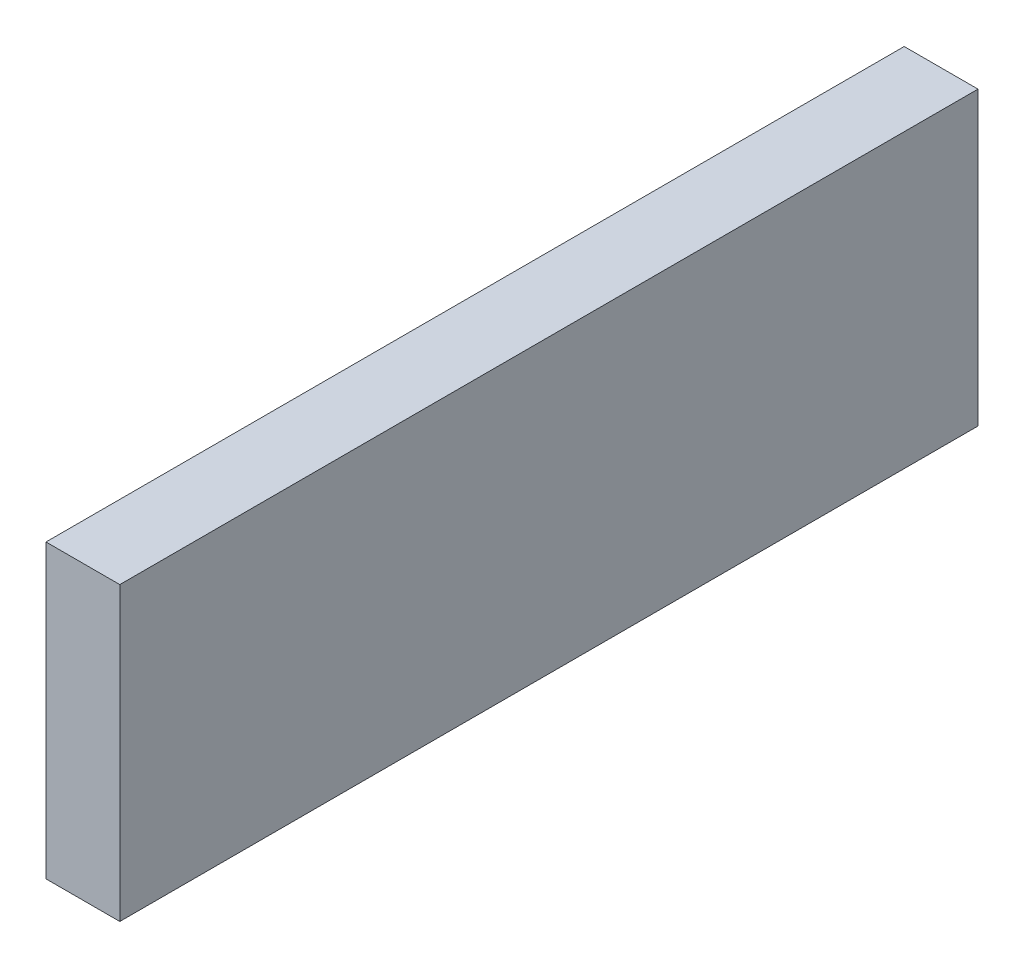
ISO-10303-21;
HEADER;
FILE_DESCRIPTION(('STEP AP214'),'2;1');
FILE_NAME('part.step','',(''),(''),'','','');
FILE_SCHEMA(('AUTOMOTIVE_DESIGN { 1 0 10303 214 1 1 1 1 }'));
ENDSEC;
DATA;
#1=APPLICATION_CONTEXT('core data for automotive mechanical design processes');
#2=APPLICATION_PROTOCOL_DEFINITION('international standard','automotive_design',2000,#1);
#3=PRODUCT_CONTEXT('',#1,'mechanical');
#4=PRODUCT('Part','Part','',(#3));
#5=PRODUCT_RELATED_PRODUCT_CATEGORY('part','',(#4));
#6=PRODUCT_DEFINITION_FORMATION('','',#4);
#7=PRODUCT_DEFINITION_CONTEXT('part definition',#1,'design');
#8=PRODUCT_DEFINITION('design','',#6,#7);
#9=PRODUCT_DEFINITION_SHAPE('','',#8);
#10=(LENGTH_UNIT() NAMED_UNIT(*) SI_UNIT(.MILLI.,.METRE.));
#11=(NAMED_UNIT(*) PLANE_ANGLE_UNIT() SI_UNIT($,.RADIAN.));
#12=(NAMED_UNIT(*) SI_UNIT($,.STERADIAN.) SOLID_ANGLE_UNIT());
#13=UNCERTAINTY_MEASURE_WITH_UNIT(LENGTH_MEASURE(1.E-05),#10,'distance_accuracy_value','');
#14=(GEOMETRIC_REPRESENTATION_CONTEXT(3) GLOBAL_UNCERTAINTY_ASSIGNED_CONTEXT((#13)) GLOBAL_UNIT_ASSIGNED_CONTEXT((#10,
#11,#12)) REPRESENTATION_CONTEXT('',''));
#15=CARTESIAN_POINT('',(0.,0.,0.));
#16=DIRECTION('',(0.,0.,1.));
#17=DIRECTION('',(1.,0.,0.));
#18=AXIS2_PLACEMENT_3D('',#15,#16,#17);
#19=CARTESIAN_POINT('',(10.922,-21.59,-63.5));
#20=DIRECTION('',(0.,0.,1.));
#21=DIRECTION('',(1.,0.,0.));
#22=AXIS2_PLACEMENT_3D('',#19,#20,#21);
#23=PLANE('',#22);
#24=DIRECTION('',(0.,1.,0.));
#25=VECTOR('',#24,1.);
#26=CARTESIAN_POINT('',(0.,-21.59,-63.5));
#27=LINE('',#26,#25);
#28=CARTESIAN_POINT('',(0.,-21.59,-63.5));
#29=VERTEX_POINT('',#28);
#30=CARTESIAN_POINT('',(0.,21.59,-63.5));
#31=VERTEX_POINT('',#30);
#32=EDGE_CURVE('E95',#29,#31,#27,.T.);
#33=ORIENTED_EDGE('',*,*,#32,.T.);
#34=DIRECTION('',(-1.,0.,0.));
#35=VECTOR('',#34,1.);
#36=CARTESIAN_POINT('',(10.922,21.59,-63.5));
#37=LINE('',#36,#35);
#38=CARTESIAN_POINT('',(10.922,21.59,-63.5));
#39=VERTEX_POINT('',#38);
#40=EDGE_CURVE('E11',#39,#31,#37,.T.);
#41=ORIENTED_EDGE('',*,*,#40,.F.);
#42=DIRECTION('',(0.,1.,0.));
#43=VECTOR('',#42,1.);
#44=CARTESIAN_POINT('',(10.922,-21.59,-63.5));
#45=LINE('',#44,#43);
#46=CARTESIAN_POINT('',(10.922,-21.59,-63.5));
#47=VERTEX_POINT('',#46);
#48=EDGE_CURVE('E83',#47,#39,#45,.T.);
#49=ORIENTED_EDGE('',*,*,#48,.F.);
#50=DIRECTION('',(-1.,0.,0.));
#51=VECTOR('',#50,1.);
#52=CARTESIAN_POINT('',(10.922,-21.59,-63.5));
#53=LINE('',#52,#51);
#54=EDGE_CURVE('E91',#47,#29,#53,.T.);
#55=ORIENTED_EDGE('',*,*,#54,.T.);
#56=EDGE_LOOP('',(#33,#41,#49,#55));
#57=FACE_BOUND('',#56,.T.);
#58=ADVANCED_FACE('F32',(#57),#23,.F.);
#59=CARTESIAN_POINT('',(10.922,21.59,63.5));
#60=DIRECTION('',(0.,-1.,0.));
#61=DIRECTION('',(0.,0.,-1.));
#62=AXIS2_PLACEMENT_3D('',#59,#60,#61);
#63=PLANE('',#62);
#64=DIRECTION('',(0.,0.,1.));
#65=VECTOR('',#64,1.);
#66=CARTESIAN_POINT('',(0.,21.59,63.5));
#67=LINE('',#66,#65);
#68=CARTESIAN_POINT('',(0.,21.59,63.5));
#69=VERTEX_POINT('',#68);
#70=EDGE_CURVE('E87',#31,#69,#67,.T.);
#71=ORIENTED_EDGE('',*,*,#70,.T.);
#72=DIRECTION('',(-1.,0.,0.));
#73=VECTOR('',#72,1.);
#74=CARTESIAN_POINT('',(10.922,21.59,63.5));
#75=LINE('',#74,#73);
#76=CARTESIAN_POINT('',(10.922,21.59,63.5));
#77=VERTEX_POINT('',#76);
#78=EDGE_CURVE('E40',#77,#69,#75,.T.);
#79=ORIENTED_EDGE('',*,*,#78,.F.);
#80=DIRECTION('',(0.,0.,1.));
#81=VECTOR('',#80,1.);
#82=CARTESIAN_POINT('',(10.922,21.59,63.5));
#83=LINE('',#82,#81);
#84=EDGE_CURVE('E78',#39,#77,#83,.T.);
#85=ORIENTED_EDGE('',*,*,#84,.F.);
#86=ORIENTED_EDGE('',*,*,#40,.T.);
#87=EDGE_LOOP('',(#71,#79,#85,#86));
#88=FACE_BOUND('',#87,.T.);
#89=ADVANCED_FACE('F86',(#88),#63,.F.);
#90=CARTESIAN_POINT('',(10.922,-21.59,63.5));
#91=DIRECTION('',(0.,0.,-1.));
#92=DIRECTION('',(-1.,0.,0.));
#93=AXIS2_PLACEMENT_3D('',#90,#91,#92);
#94=PLANE('',#93);
#95=DIRECTION('',(0.,-1.,0.));
#96=VECTOR('',#95,1.);
#97=CARTESIAN_POINT('',(0.,-21.59,63.5));
#98=LINE('',#97,#96);
#99=CARTESIAN_POINT('',(0.,-21.59,63.5));
#100=VERTEX_POINT('',#99);
#101=EDGE_CURVE('E65',#69,#100,#98,.T.);
#102=ORIENTED_EDGE('',*,*,#101,.T.);
#103=DIRECTION('',(-1.,0.,0.));
#104=VECTOR('',#103,1.);
#105=CARTESIAN_POINT('',(10.922,-21.59,63.5));
#106=LINE('',#105,#104);
#107=CARTESIAN_POINT('',(10.922,-21.59,63.5));
#108=VERTEX_POINT('',#107);
#109=EDGE_CURVE('E88',#108,#100,#106,.T.);
#110=ORIENTED_EDGE('',*,*,#109,.F.);
#111=DIRECTION('',(0.,-1.,0.));
#112=VECTOR('',#111,1.);
#113=CARTESIAN_POINT('',(10.922,-21.59,63.5));
#114=LINE('',#113,#112);
#115=EDGE_CURVE('E81',#77,#108,#114,.T.);
#116=ORIENTED_EDGE('',*,*,#115,.F.);
#117=ORIENTED_EDGE('',*,*,#78,.T.);
#118=EDGE_LOOP('',(#102,#110,#116,#117));
#119=FACE_BOUND('',#118,.T.);
#120=ADVANCED_FACE('F89',(#119),#94,.F.);
#121=CARTESIAN_POINT('',(10.922,-21.59,63.5));
#122=DIRECTION('',(0.,1.,0.));
#123=DIRECTION('',(0.,0.,1.));
#124=AXIS2_PLACEMENT_3D('',#121,#122,#123);
#125=PLANE('',#124);
#126=DIRECTION('',(0.,0.,-1.));
#127=VECTOR('',#126,1.);
#128=CARTESIAN_POINT('',(0.,-21.59,63.5));
#129=LINE('',#128,#127);
#130=EDGE_CURVE('E71',#100,#29,#129,.T.);
#131=ORIENTED_EDGE('',*,*,#130,.T.);
#132=ORIENTED_EDGE('',*,*,#54,.F.);
#133=DIRECTION('',(0.,0.,-1.));
#134=VECTOR('',#133,1.);
#135=CARTESIAN_POINT('',(10.922,-21.59,63.5));
#136=LINE('',#135,#134);
#137=EDGE_CURVE('E48',#108,#47,#136,.T.);
#138=ORIENTED_EDGE('',*,*,#137,.F.);
#139=ORIENTED_EDGE('',*,*,#109,.T.);
#140=EDGE_LOOP('',(#131,#132,#138,#139));
#141=FACE_BOUND('',#140,.T.);
#142=ADVANCED_FACE('F102',(#141),#125,.F.);
#143=CARTESIAN_POINT('',(10.922,0.,0.));
#144=DIRECTION('',(-1.,0.,0.));
#145=DIRECTION('',(0.,0.,1.));
#146=AXIS2_PLACEMENT_3D('',#143,#144,#145);
#147=PLANE('',#146);
#148=ORIENTED_EDGE('',*,*,#48,.T.);
#149=ORIENTED_EDGE('',*,*,#84,.T.);
#150=ORIENTED_EDGE('',*,*,#115,.T.);
#151=ORIENTED_EDGE('',*,*,#137,.T.);
#152=EDGE_LOOP('',(#148,#149,#150,#151));
#153=FACE_BOUND('',#152,.T.);
#154=ADVANCED_FACE('F79',(#153),#147,.F.);
#155=CARTESIAN_POINT('',(0.,0.,0.));
#156=DIRECTION('',(-1.,0.,0.));
#157=DIRECTION('',(0.,0.,1.));
#158=AXIS2_PLACEMENT_3D('',#155,#156,#157);
#159=PLANE('',#158);
#160=ORIENTED_EDGE('',*,*,#32,.F.);
#161=ORIENTED_EDGE('',*,*,#130,.F.);
#162=ORIENTED_EDGE('',*,*,#101,.F.);
#163=ORIENTED_EDGE('',*,*,#70,.F.);
#164=EDGE_LOOP('',(#160,#161,#162,#163));
#165=FACE_BOUND('',#164,.T.);
#166=ADVANCED_FACE('F105',(#165),#159,.T.);
#167=CLOSED_SHELL('',(#58,#89,#120,#142,#154,#166));
#168=MANIFOLD_SOLID_BREP('B2',#167);
#169=ADVANCED_BREP_SHAPE_REPRESENTATION('',(#18,#168),#14);
#170=SHAPE_DEFINITION_REPRESENTATION(#9,#169);
ENDSEC;
END-ISO-10303-21;
